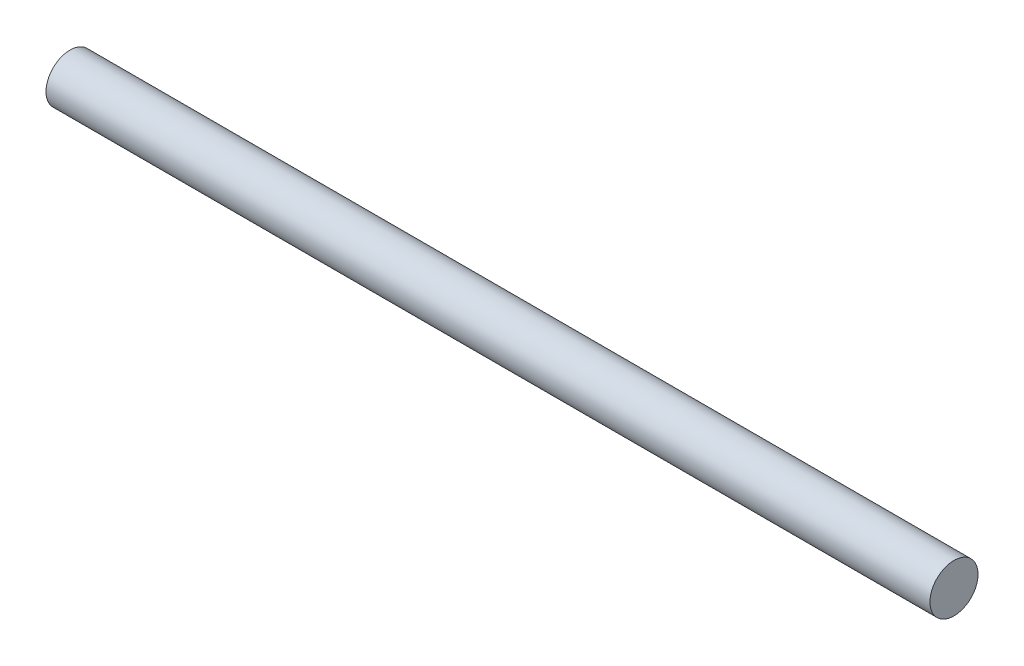
ISO-10303-21;
HEADER;
FILE_DESCRIPTION(('STEP AP214'),'2;1');
FILE_NAME('part.step','',(''),(''),'','','');
FILE_SCHEMA(('AUTOMOTIVE_DESIGN { 1 0 10303 214 1 1 1 1 }'));
ENDSEC;
DATA;
#1=APPLICATION_CONTEXT('core data for automotive mechanical design processes');
#2=APPLICATION_PROTOCOL_DEFINITION('international standard','automotive_design',2000,#1);
#3=PRODUCT_CONTEXT('',#1,'mechanical');
#4=PRODUCT('Part','Part','',(#3));
#5=PRODUCT_RELATED_PRODUCT_CATEGORY('part','',(#4));
#6=PRODUCT_DEFINITION_FORMATION('','',#4);
#7=PRODUCT_DEFINITION_CONTEXT('part definition',#1,'design');
#8=PRODUCT_DEFINITION('design','',#6,#7);
#9=PRODUCT_DEFINITION_SHAPE('','',#8);
#10=(LENGTH_UNIT() NAMED_UNIT(*) SI_UNIT(.MILLI.,.METRE.));
#11=(NAMED_UNIT(*) PLANE_ANGLE_UNIT() SI_UNIT($,.RADIAN.));
#12=(NAMED_UNIT(*) SI_UNIT($,.STERADIAN.) SOLID_ANGLE_UNIT());
#13=UNCERTAINTY_MEASURE_WITH_UNIT(LENGTH_MEASURE(1.E-05),#10,'distance_accuracy_value','');
#14=(GEOMETRIC_REPRESENTATION_CONTEXT(3) GLOBAL_UNCERTAINTY_ASSIGNED_CONTEXT((#13)) GLOBAL_UNIT_ASSIGNED_CONTEXT((#10,
#11,#12)) REPRESENTATION_CONTEXT('',''));
#15=CARTESIAN_POINT('',(0.,0.,0.));
#16=DIRECTION('',(0.,0.,1.));
#17=DIRECTION('',(1.,0.,0.));
#18=AXIS2_PLACEMENT_3D('',#15,#16,#17);
#19=CARTESIAN_POINT('',(114.,0.,0.));
#20=DIRECTION('',(-1.,0.,0.));
#21=DIRECTION('',(0.,0.,1.));
#22=AXIS2_PLACEMENT_3D('',#19,#20,#21);
#23=CYLINDRICAL_SURFACE('',#22,3.1);
#24=CARTESIAN_POINT('',(114.,0.,0.));
#25=DIRECTION('',(1.,0.,0.));
#26=DIRECTION('',(0.,0.,-1.));
#27=AXIS2_PLACEMENT_3D('',#24,#25,#26);
#28=CIRCLE('',#27,3.1);
#29=CARTESIAN_POINT('',(114.,0.,3.1));
#30=VERTEX_POINT('',#29);
#31=EDGE_CURVE('E10',#30,#30,#28,.T.);
#32=CARTESIAN_POINT('',(0.,0.,0.));
#33=DIRECTION('',(1.,0.,0.));
#34=DIRECTION('',(0.,0.,-1.));
#35=AXIS2_PLACEMENT_3D('',#32,#33,#34);
#36=CIRCLE('',#35,3.1);
#37=CARTESIAN_POINT('',(0.,0.,3.1));
#38=VERTEX_POINT('',#37);
#39=EDGE_CURVE('E40',#38,#38,#36,.T.);
#40=CARTESIAN_POINT('',(114.,0.,3.1));
#41=CARTESIAN_POINT('',(112.8125,0.,3.1));
#42=CARTESIAN_POINT('',(111.625,0.,3.1));
#43=CARTESIAN_POINT('',(109.25,0.,3.1));
#44=CARTESIAN_POINT('',(108.0625,0.,3.1));
#45=CARTESIAN_POINT('',(105.6875,0.,3.1));
#46=CARTESIAN_POINT('',(104.5,0.,3.1));
#47=CARTESIAN_POINT('',(102.125,0.,3.1));
#48=CARTESIAN_POINT('',(100.9375,0.,3.1));
#49=CARTESIAN_POINT('',(98.5625,0.,3.1));
#50=CARTESIAN_POINT('',(97.375,0.,3.1));
#51=CARTESIAN_POINT('',(95.,0.,3.1));
#52=CARTESIAN_POINT('',(93.8125,0.,3.1));
#53=CARTESIAN_POINT('',(91.4375,0.,3.1));
#54=CARTESIAN_POINT('',(90.25,0.,3.1));
#55=CARTESIAN_POINT('',(87.875,0.,3.1));
#56=CARTESIAN_POINT('',(86.6875,0.,3.1));
#57=CARTESIAN_POINT('',(84.3125,0.,3.1));
#58=CARTESIAN_POINT('',(83.125,0.,3.1));
#59=CARTESIAN_POINT('',(80.75,0.,3.1));
#60=CARTESIAN_POINT('',(79.5625,0.,3.1));
#61=CARTESIAN_POINT('',(77.1875,0.,3.1));
#62=CARTESIAN_POINT('',(76.,0.,3.1));
#63=CARTESIAN_POINT('',(73.625,0.,3.1));
#64=CARTESIAN_POINT('',(72.4375,0.,3.1));
#65=CARTESIAN_POINT('',(70.0625,0.,3.1));
#66=CARTESIAN_POINT('',(68.875,0.,3.1));
#67=CARTESIAN_POINT('',(66.5,0.,3.1));
#68=CARTESIAN_POINT('',(65.3125,0.,3.1));
#69=CARTESIAN_POINT('',(62.9375,0.,3.1));
#70=CARTESIAN_POINT('',(61.75,0.,3.1));
#71=CARTESIAN_POINT('',(59.375,0.,3.1));
#72=CARTESIAN_POINT('',(58.1875,0.,3.1));
#73=CARTESIAN_POINT('',(55.8125,0.,3.1));
#74=CARTESIAN_POINT('',(54.625,0.,3.1));
#75=CARTESIAN_POINT('',(52.25,0.,3.1));
#76=CARTESIAN_POINT('',(51.0625,0.,3.1));
#77=CARTESIAN_POINT('',(48.6875,0.,3.1));
#78=CARTESIAN_POINT('',(47.5,0.,3.1));
#79=CARTESIAN_POINT('',(45.125,0.,3.1));
#80=CARTESIAN_POINT('',(43.9375,0.,3.1));
#81=CARTESIAN_POINT('',(41.5625,0.,3.1));
#82=CARTESIAN_POINT('',(40.375,0.,3.1));
#83=CARTESIAN_POINT('',(38.,0.,3.1));
#84=CARTESIAN_POINT('',(36.8125,0.,3.1));
#85=CARTESIAN_POINT('',(34.4375,0.,3.1));
#86=CARTESIAN_POINT('',(33.25,0.,3.1));
#87=CARTESIAN_POINT('',(30.875,0.,3.1));
#88=CARTESIAN_POINT('',(29.6875,0.,3.1));
#89=CARTESIAN_POINT('',(27.3125,0.,3.1));
#90=CARTESIAN_POINT('',(26.125,0.,3.1));
#91=CARTESIAN_POINT('',(23.75,0.,3.1));
#92=CARTESIAN_POINT('',(22.5625,0.,3.1));
#93=CARTESIAN_POINT('',(20.1875,0.,3.1));
#94=CARTESIAN_POINT('',(19.,0.,3.1));
#95=CARTESIAN_POINT('',(16.625,0.,3.1));
#96=CARTESIAN_POINT('',(15.4375,0.,3.1));
#97=CARTESIAN_POINT('',(13.0625,0.,3.1));
#98=CARTESIAN_POINT('',(11.875,0.,3.1));
#99=CARTESIAN_POINT('',(9.5,0.,3.1));
#100=CARTESIAN_POINT('',(8.31250000000001,0.,3.1));
#101=CARTESIAN_POINT('',(5.9375,0.,3.1));
#102=CARTESIAN_POINT('',(4.75,0.,3.1));
#103=CARTESIAN_POINT('',(2.375,0.,3.1));
#104=CARTESIAN_POINT('',(1.1875,0.,3.1));
#105=CARTESIAN_POINT('',(0.,0.,3.1));
#106=B_SPLINE_CURVE_WITH_KNOTS('',3,(#40,#41,#42,#43,#44,#45,#46,#47,#48,#49,#50,#51,#52,#53,
#54,#55,#56,#57,#58,#59,#60,#61,#62,#63,#64,#65,#66,#67,#68,#69,#70,#71,#72,#73,#74,#75,#76,#77,
#78,#79,#80,#81,#82,#83,#84,#85,#86,#87,#88,#89,#90,#91,#92,#93,#94,#95,#96,#97,#98,#99,#100,
#101,#102,#103,#104,#105),.UNSPECIFIED.,.F.,.F.,(4,2,2,2,2,2,2,2,2,2,2,2,2,2,2,2,2,2,2,2,2,2,2,
2,2,2,2,2,2,2,2,2,4),(0.,3.56250000000001,7.12500000000001,10.6875,14.25,17.8125,21.375,24.9375,
28.5,32.0625,35.625,39.1875,42.75,46.3125,49.875,53.4375,57.,60.5625,64.125,67.6875,71.25,
74.8125,78.375,81.9375,85.5,89.0625,92.625,96.1875,99.75,103.3125,106.875,110.4375,114.),.UNSPECIFIED.);
#107=EDGE_CURVE('BSEAM37',#30,#38,#106,.T.);
#108=ORIENTED_EDGE('',*,*,#31,.F.);
#109=ORIENTED_EDGE('',*,*,#39,.T.);
#110=ORIENTED_EDGE('',*,*,#107,.T.);
#111=ORIENTED_EDGE('',*,*,#107,.F.);
#112=EDGE_LOOP('',(#108,#110,#109,#111));
#113=FACE_BOUND('',#112,.T.);
#114=ADVANCED_FACE('F37',(#113),#23,.T.);
#115=CARTESIAN_POINT('',(114.,0.,0.));
#116=DIRECTION('',(1.,0.,0.));
#117=DIRECTION('',(0.,0.,-1.));
#118=AXIS2_PLACEMENT_3D('',#115,#116,#117);
#119=PLANE('',#118);
#120=ORIENTED_EDGE('',*,*,#31,.T.);
#121=EDGE_LOOP('',(#120));
#122=FACE_BOUND('',#121,.T.);
#123=ADVANCED_FACE('F54',(#122),#119,.T.);
#124=CARTESIAN_POINT('',(0.,0.,0.));
#125=DIRECTION('',(1.,0.,0.));
#126=DIRECTION('',(0.,0.,-1.));
#127=AXIS2_PLACEMENT_3D('',#124,#125,#126);
#128=PLANE('',#127);
#129=ORIENTED_EDGE('',*,*,#39,.F.);
#130=EDGE_LOOP('',(#129));
#131=FACE_BOUND('',#130,.T.);
#132=ADVANCED_FACE('F52',(#131),#128,.F.);
#133=CLOSED_SHELL('',(#114,#123,#132));
#134=MANIFOLD_SOLID_BREP('B2',#133);
#135=ADVANCED_BREP_SHAPE_REPRESENTATION('',(#18,#134),#14);
#136=SHAPE_DEFINITION_REPRESENTATION(#9,#135);
ENDSEC;
END-ISO-10303-21;
